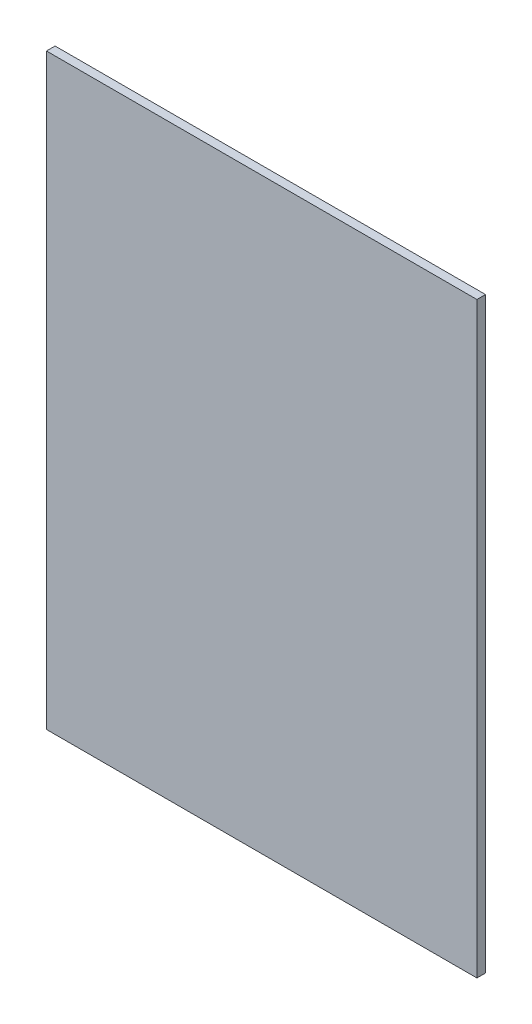
ISO-10303-21;
HEADER;
FILE_DESCRIPTION(('STEP AP214'),'2;1');
FILE_NAME('part.step','',(''),(''),'','','');
FILE_SCHEMA(('AUTOMOTIVE_DESIGN { 1 0 10303 214 1 1 1 1 }'));
ENDSEC;
DATA;
#1=APPLICATION_CONTEXT('core data for automotive mechanical design processes');
#2=APPLICATION_PROTOCOL_DEFINITION('international standard','automotive_design',2000,#1);
#3=PRODUCT_CONTEXT('',#1,'mechanical');
#4=PRODUCT('Part','Part','',(#3));
#5=PRODUCT_RELATED_PRODUCT_CATEGORY('part','',(#4));
#6=PRODUCT_DEFINITION_FORMATION('','',#4);
#7=PRODUCT_DEFINITION_CONTEXT('part definition',#1,'design');
#8=PRODUCT_DEFINITION('design','',#6,#7);
#9=PRODUCT_DEFINITION_SHAPE('','',#8);
#10=(LENGTH_UNIT() NAMED_UNIT(*) SI_UNIT(.MILLI.,.METRE.));
#11=(NAMED_UNIT(*) PLANE_ANGLE_UNIT() SI_UNIT($,.RADIAN.));
#12=(NAMED_UNIT(*) SI_UNIT($,.STERADIAN.) SOLID_ANGLE_UNIT());
#13=UNCERTAINTY_MEASURE_WITH_UNIT(LENGTH_MEASURE(1.E-05),#10,'distance_accuracy_value','');
#14=(GEOMETRIC_REPRESENTATION_CONTEXT(3) GLOBAL_UNCERTAINTY_ASSIGNED_CONTEXT((#13)) GLOBAL_UNIT_ASSIGNED_CONTEXT((#10,
#11,#12)) REPRESENTATION_CONTEXT('',''));
#15=CARTESIAN_POINT('',(0.,0.,0.));
#16=DIRECTION('',(0.,0.,1.));
#17=DIRECTION('',(1.,0.,0.));
#18=AXIS2_PLACEMENT_3D('',#15,#16,#17);
#19=CARTESIAN_POINT('',(50.,68.25,-2.));
#20=DIRECTION('',(1.,0.,0.));
#21=DIRECTION('',(0.,1.,0.));
#22=AXIS2_PLACEMENT_3D('',#19,#20,#21);
#23=PLANE('',#22);
#24=DIRECTION('',(0.,1.,0.));
#25=VECTOR('',#24,1.);
#26=CARTESIAN_POINT('',(50.,68.25,0.));
#27=LINE('',#26,#25);
#28=CARTESIAN_POINT('',(50.,-68.25,0.));
#29=VERTEX_POINT('',#28);
#30=CARTESIAN_POINT('',(50.,68.25,0.));
#31=VERTEX_POINT('',#30);
#32=EDGE_CURVE('E101',#29,#31,#27,.T.);
#33=ORIENTED_EDGE('',*,*,#32,.F.);
#34=DIRECTION('',(0.,0.,1.));
#35=VECTOR('',#34,1.);
#36=CARTESIAN_POINT('',(50.,-68.25,-2.));
#37=LINE('',#36,#35);
#38=CARTESIAN_POINT('',(50.,-68.25,-2.));
#39=VERTEX_POINT('',#38);
#40=EDGE_CURVE('E11',#39,#29,#37,.T.);
#41=ORIENTED_EDGE('',*,*,#40,.F.);
#42=DIRECTION('',(0.,1.,0.));
#43=VECTOR('',#42,1.);
#44=CARTESIAN_POINT('',(50.,68.25,-2.));
#45=LINE('',#44,#43);
#46=CARTESIAN_POINT('',(50.,68.25,-2.));
#47=VERTEX_POINT('',#46);
#48=EDGE_CURVE('E95',#39,#47,#45,.T.);
#49=ORIENTED_EDGE('',*,*,#48,.T.);
#50=DIRECTION('',(0.,0.,1.));
#51=VECTOR('',#50,1.);
#52=CARTESIAN_POINT('',(50.,68.25,-2.));
#53=LINE('',#52,#51);
#54=EDGE_CURVE('E40',#47,#31,#53,.T.);
#55=ORIENTED_EDGE('',*,*,#54,.T.);
#56=EDGE_LOOP('',(#33,#41,#49,#55));
#57=FACE_BOUND('',#56,.T.);
#58=ADVANCED_FACE('F37',(#57),#23,.T.);
#59=CARTESIAN_POINT('',(-50.,-68.25,-2.));
#60=DIRECTION('',(0.,-1.,0.));
#61=DIRECTION('',(0.,0.,-1.));
#62=AXIS2_PLACEMENT_3D('',#59,#60,#61);
#63=PLANE('',#62);
#64=DIRECTION('',(1.,0.,0.));
#65=VECTOR('',#64,1.);
#66=CARTESIAN_POINT('',(-50.,-68.25,0.));
#67=LINE('',#66,#65);
#68=CARTESIAN_POINT('',(-50.,-68.25,0.));
#69=VERTEX_POINT('',#68);
#70=EDGE_CURVE('E97',#69,#29,#67,.T.);
#71=ORIENTED_EDGE('',*,*,#70,.F.);
#72=DIRECTION('',(0.,0.,1.));
#73=VECTOR('',#72,1.);
#74=CARTESIAN_POINT('',(-50.,-68.25,-2.));
#75=LINE('',#74,#73);
#76=CARTESIAN_POINT('',(-50.,-68.25,-2.));
#77=VERTEX_POINT('',#76);
#78=EDGE_CURVE('E46',#77,#69,#75,.T.);
#79=ORIENTED_EDGE('',*,*,#78,.F.);
#80=DIRECTION('',(1.,0.,0.));
#81=VECTOR('',#80,1.);
#82=CARTESIAN_POINT('',(-50.,-68.25,-2.));
#83=LINE('',#82,#81);
#84=EDGE_CURVE('E92',#77,#39,#83,.T.);
#85=ORIENTED_EDGE('',*,*,#84,.T.);
#86=ORIENTED_EDGE('',*,*,#40,.T.);
#87=EDGE_LOOP('',(#71,#79,#85,#86));
#88=FACE_BOUND('',#87,.T.);
#89=ADVANCED_FACE('F111',(#88),#63,.T.);
#90=CARTESIAN_POINT('',(-50.,68.25,-2.));
#91=DIRECTION('',(-1.,0.,0.));
#92=DIRECTION('',(0.,-1.,0.));
#93=AXIS2_PLACEMENT_3D('',#90,#91,#92);
#94=PLANE('',#93);
#95=DIRECTION('',(0.,-1.,0.));
#96=VECTOR('',#95,1.);
#97=CARTESIAN_POINT('',(-50.,68.25,0.));
#98=LINE('',#97,#96);
#99=CARTESIAN_POINT('',(-50.,68.25,0.));
#100=VERTEX_POINT('',#99);
#101=EDGE_CURVE('E87',#100,#69,#98,.T.);
#102=ORIENTED_EDGE('',*,*,#101,.F.);
#103=DIRECTION('',(0.,0.,1.));
#104=VECTOR('',#103,1.);
#105=CARTESIAN_POINT('',(-50.,68.25,-2.));
#106=LINE('',#105,#104);
#107=CARTESIAN_POINT('',(-50.,68.25,-2.));
#108=VERTEX_POINT('',#107);
#109=EDGE_CURVE('E82',#108,#100,#106,.T.);
#110=ORIENTED_EDGE('',*,*,#109,.F.);
#111=DIRECTION('',(0.,-1.,0.));
#112=VECTOR('',#111,1.);
#113=CARTESIAN_POINT('',(-50.,68.25,-2.));
#114=LINE('',#113,#112);
#115=EDGE_CURVE('E85',#108,#77,#114,.T.);
#116=ORIENTED_EDGE('',*,*,#115,.T.);
#117=ORIENTED_EDGE('',*,*,#78,.T.);
#118=EDGE_LOOP('',(#102,#110,#116,#117));
#119=FACE_BOUND('',#118,.T.);
#120=ADVANCED_FACE('F84',(#119),#94,.T.);
#121=CARTESIAN_POINT('',(-50.,68.25,-2.));
#122=DIRECTION('',(0.,1.,0.));
#123=DIRECTION('',(0.,0.,1.));
#124=AXIS2_PLACEMENT_3D('',#121,#122,#123);
#125=PLANE('',#124);
#126=DIRECTION('',(-1.,0.,0.));
#127=VECTOR('',#126,1.);
#128=CARTESIAN_POINT('',(-50.,68.25,0.));
#129=LINE('',#128,#127);
#130=EDGE_CURVE('E104',#31,#100,#129,.T.);
#131=ORIENTED_EDGE('',*,*,#130,.F.);
#132=ORIENTED_EDGE('',*,*,#54,.F.);
#133=DIRECTION('',(-1.,0.,0.));
#134=VECTOR('',#133,1.);
#135=CARTESIAN_POINT('',(-50.,68.25,-2.));
#136=LINE('',#135,#134);
#137=EDGE_CURVE('E91',#47,#108,#136,.T.);
#138=ORIENTED_EDGE('',*,*,#137,.T.);
#139=ORIENTED_EDGE('',*,*,#109,.T.);
#140=EDGE_LOOP('',(#131,#132,#138,#139));
#141=FACE_BOUND('',#140,.T.);
#142=ADVANCED_FACE('F94',(#141),#125,.T.);
#143=CARTESIAN_POINT('',(0.,0.,-2.));
#144=DIRECTION('',(0.,0.,1.));
#145=DIRECTION('',(1.,0.,0.));
#146=AXIS2_PLACEMENT_3D('',#143,#144,#145);
#147=PLANE('',#146);
#148=ORIENTED_EDGE('',*,*,#48,.F.);
#149=ORIENTED_EDGE('',*,*,#84,.F.);
#150=ORIENTED_EDGE('',*,*,#115,.F.);
#151=ORIENTED_EDGE('',*,*,#137,.F.);
#152=EDGE_LOOP('',(#148,#149,#150,#151));
#153=FACE_BOUND('',#152,.T.);
#154=ADVANCED_FACE('F90',(#153),#147,.F.);
#155=CARTESIAN_POINT('',(0.,0.,0.));
#156=DIRECTION('',(0.,0.,1.));
#157=DIRECTION('',(1.,0.,0.));
#158=AXIS2_PLACEMENT_3D('',#155,#156,#157);
#159=PLANE('',#158);
#160=ORIENTED_EDGE('',*,*,#32,.T.);
#161=ORIENTED_EDGE('',*,*,#130,.T.);
#162=ORIENTED_EDGE('',*,*,#101,.T.);
#163=ORIENTED_EDGE('',*,*,#70,.T.);
#164=EDGE_LOOP('',(#160,#161,#162,#163));
#165=FACE_BOUND('',#164,.T.);
#166=ADVANCED_FACE('F110',(#165),#159,.T.);
#167=CLOSED_SHELL('',(#58,#89,#120,#142,#154,#166));
#168=MANIFOLD_SOLID_BREP('B2',#167);
#169=ADVANCED_BREP_SHAPE_REPRESENTATION('',(#18,#168),#14);
#170=SHAPE_DEFINITION_REPRESENTATION(#9,#169);
ENDSEC;
END-ISO-10303-21;
